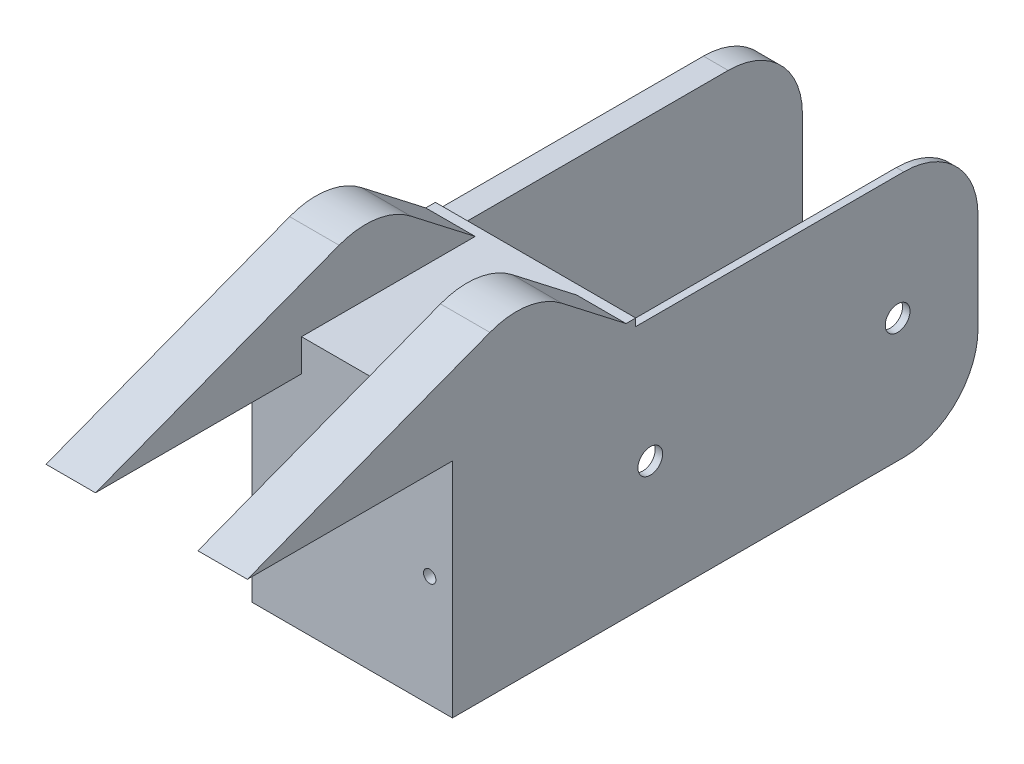
ISO-10303-21;
HEADER;
FILE_DESCRIPTION(('STEP AP214'),'2;1');
FILE_NAME('part.step','',(''),(''),'','','');
FILE_SCHEMA(('AUTOMOTIVE_DESIGN { 1 0 10303 214 1 1 1 1 }'));
ENDSEC;
DATA;
#1=APPLICATION_CONTEXT('core data for automotive mechanical design processes');
#2=APPLICATION_PROTOCOL_DEFINITION('international standard','automotive_design',2000,#1);
#3=PRODUCT_CONTEXT('',#1,'mechanical');
#4=PRODUCT('Part','Part','',(#3));
#5=PRODUCT_RELATED_PRODUCT_CATEGORY('part','',(#4));
#6=PRODUCT_DEFINITION_FORMATION('','',#4);
#7=PRODUCT_DEFINITION_CONTEXT('part definition',#1,'design');
#8=PRODUCT_DEFINITION('design','',#6,#7);
#9=PRODUCT_DEFINITION_SHAPE('','',#8);
#10=(LENGTH_UNIT() NAMED_UNIT(*) SI_UNIT(.MILLI.,.METRE.));
#11=(NAMED_UNIT(*) PLANE_ANGLE_UNIT() SI_UNIT($,.RADIAN.));
#12=(NAMED_UNIT(*) SI_UNIT($,.STERADIAN.) SOLID_ANGLE_UNIT());
#13=UNCERTAINTY_MEASURE_WITH_UNIT(LENGTH_MEASURE(1.E-05),#10,'distance_accuracy_value','');
#14=(GEOMETRIC_REPRESENTATION_CONTEXT(3) GLOBAL_UNCERTAINTY_ASSIGNED_CONTEXT((#13)) GLOBAL_UNIT_ASSIGNED_CONTEXT((#10,
#11,#12)) REPRESENTATION_CONTEXT('',''));
#15=CARTESIAN_POINT('',(0.,0.,0.));
#16=DIRECTION('',(0.,0.,1.));
#17=DIRECTION('',(1.,0.,0.));
#18=AXIS2_PLACEMENT_3D('',#15,#16,#17);
#19=CARTESIAN_POINT('',(0.,50.,0.));
#20=DIRECTION('',(0.,1.,0.));
#21=DIRECTION('',(0.,0.,1.));
#22=AXIS2_PLACEMENT_3D('',#19,#20,#21);
#23=PLANE('',#22);
#24=DIRECTION('',(0.,0.,1.));
#25=VECTOR('',#24,1.);
#26=CARTESIAN_POINT('',(19.5,50.,-212.500000000048));
#27=LINE('',#26,#25);
#28=CARTESIAN_POINT('',(19.5,50.,-182.500000000048));
#29=VERTEX_POINT('',#28);
#30=CARTESIAN_POINT('',(19.5,50.,-74.1157878446346));
#31=VERTEX_POINT('',#30);
#32=EDGE_CURVE('E286',#29,#31,#27,.T.);
#33=ORIENTED_EDGE('',*,*,#32,.F.);
#34=DIRECTION('',(-1.,0.,0.));
#35=VECTOR('',#34,1.);
#36=CARTESIAN_POINT('',(0.,50.,-182.500000000048));
#37=LINE('',#36,#35);
#38=CARTESIAN_POINT('',(9.50000000000002,50.,-182.500000000048));
#39=VERTEX_POINT('',#38);
#40=EDGE_CURVE('E419',#29,#39,#37,.T.);
#41=ORIENTED_EDGE('',*,*,#40,.T.);
#42=DIRECTION('',(0.,0.,1.));
#43=VECTOR('',#42,1.);
#44=CARTESIAN_POINT('',(9.5,50.,0.));
#45=LINE('',#44,#43);
#46=CARTESIAN_POINT('',(9.50000000000001,50.,-74.1157878446346));
#47=VERTEX_POINT('',#46);
#48=EDGE_CURVE('E358',#39,#47,#45,.T.);
#49=ORIENTED_EDGE('',*,*,#48,.T.);
#50=DIRECTION('',(1.,0.,0.));
#51=VECTOR('',#50,1.);
#52=CARTESIAN_POINT('',(9.49999999999999,50.,-74.1157878446346));
#53=LINE('',#52,#51);
#54=EDGE_CURVE('E307',#47,#31,#53,.T.);
#55=ORIENTED_EDGE('',*,*,#54,.T.);
#56=EDGE_LOOP('',(#33,#41,#49,#55));
#57=FACE_BOUND('',#56,.T.);
#58=ADVANCED_FACE('F43',(#57),#23,.T.);
#59=CARTESIAN_POINT('',(0.,-50.,-212.500000000048));
#60=DIRECTION('',(0.,0.,-1.));
#61=DIRECTION('',(-1.,0.,0.));
#62=AXIS2_PLACEMENT_3D('',#59,#60,#61);
#63=PLANE('',#62);
#64=DIRECTION('',(0.,1.,0.));
#65=VECTOR('',#64,1.);
#66=CARTESIAN_POINT('',(9.50000000000002,-50.,-212.500000000048));
#67=LINE('',#66,#65);
#68=CARTESIAN_POINT('',(9.50000000000002,-20.,-212.500000000048));
#69=VERTEX_POINT('',#68);
#70=CARTESIAN_POINT('',(9.50000000000002,20.,-212.500000000048));
#71=VERTEX_POINT('',#70);
#72=EDGE_CURVE('E366',#69,#71,#67,.T.);
#73=ORIENTED_EDGE('',*,*,#72,.T.);
#74=DIRECTION('',(-1.,0.,0.));
#75=VECTOR('',#74,1.);
#76=CARTESIAN_POINT('',(0.,20.,-212.500000000048));
#77=LINE('',#76,#75);
#78=CARTESIAN_POINT('',(19.5,20.,-212.500000000048));
#79=VERTEX_POINT('',#78);
#80=EDGE_CURVE('E59',#71,#79,#77,.F.);
#81=ORIENTED_EDGE('',*,*,#80,.T.);
#82=DIRECTION('',(0.,1.,0.));
#83=VECTOR('',#82,1.);
#84=CARTESIAN_POINT('',(19.5,-50.,-212.500000000048));
#85=LINE('',#84,#83);
#86=CARTESIAN_POINT('',(19.5,-20.,-212.500000000048));
#87=VERTEX_POINT('',#86);
#88=EDGE_CURVE('E283',#87,#79,#85,.T.);
#89=ORIENTED_EDGE('',*,*,#88,.F.);
#90=DIRECTION('',(-1.,0.,0.));
#91=VECTOR('',#90,1.);
#92=CARTESIAN_POINT('',(9.50000000000002,-20.,-212.500000000048));
#93=LINE('',#92,#91);
#94=EDGE_CURVE('E426',#87,#69,#93,.T.);
#95=ORIENTED_EDGE('',*,*,#94,.T.);
#96=EDGE_LOOP('',(#73,#81,#89,#95));
#97=FACE_BOUND('',#96,.T.);
#98=ADVANCED_FACE('F432',(#97),#63,.T.);
#99=CARTESIAN_POINT('',(0.,-50.,0.));
#100=DIRECTION('',(0.,1.,0.));
#101=DIRECTION('',(0.,0.,1.));
#102=AXIS2_PLACEMENT_3D('',#99,#100,#101);
#103=PLANE('',#102);
#104=DIRECTION('',(0.,0.,1.));
#105=VECTOR('',#104,1.);
#106=CARTESIAN_POINT('',(87.5,-50.,0.));
#107=LINE('',#106,#105);
#108=CARTESIAN_POINT('',(87.5,-50.,-182.500000000048));
#109=VERTEX_POINT('',#108);
#110=CARTESIAN_POINT('',(87.5,-50.,-5.));
#111=VERTEX_POINT('',#110);
#112=EDGE_CURVE('E368',#109,#111,#107,.T.);
#113=ORIENTED_EDGE('',*,*,#112,.F.);
#114=DIRECTION('',(-1.,0.,0.));
#115=VECTOR('',#114,1.);
#116=CARTESIAN_POINT('',(90.5,-50.,-182.500000000048));
#117=LINE('',#116,#115);
#118=CARTESIAN_POINT('',(90.5,-50.,-182.500000000048));
#119=VERTEX_POINT('',#118);
#120=EDGE_CURVE('E410',#109,#119,#117,.F.);
#121=ORIENTED_EDGE('',*,*,#120,.T.);
#122=DIRECTION('',(0.,0.,1.));
#123=VECTOR('',#122,1.);
#124=CARTESIAN_POINT('',(90.5,-50.,0.));
#125=LINE('',#124,#123);
#126=CARTESIAN_POINT('',(90.5,-50.,0.));
#127=VERTEX_POINT('',#126);
#128=EDGE_CURVE('E225',#119,#127,#125,.T.);
#129=ORIENTED_EDGE('',*,*,#128,.T.);
#130=DIRECTION('',(1.,0.,0.));
#131=VECTOR('',#130,1.);
#132=CARTESIAN_POINT('',(0.,-50.,0.));
#133=LINE('',#132,#131);
#134=CARTESIAN_POINT('',(9.5,-50.,0.));
#135=VERTEX_POINT('',#134);
#136=EDGE_CURVE('E363',#135,#127,#133,.T.);
#137=ORIENTED_EDGE('',*,*,#136,.F.);
#138=DIRECTION('',(0.,0.,1.));
#139=VECTOR('',#138,1.);
#140=CARTESIAN_POINT('',(9.5,-50.,0.));
#141=LINE('',#140,#139);
#142=CARTESIAN_POINT('',(9.50000000000002,-50.,-182.500000000048));
#143=VERTEX_POINT('',#142);
#144=EDGE_CURVE('E219',#143,#135,#141,.T.);
#145=ORIENTED_EDGE('',*,*,#144,.F.);
#146=DIRECTION('',(-1.,0.,0.));
#147=VECTOR('',#146,1.);
#148=CARTESIAN_POINT('',(19.5,-50.,-182.500000000048));
#149=LINE('',#148,#147);
#150=CARTESIAN_POINT('',(19.5,-50.,-182.500000000048));
#151=VERTEX_POINT('',#150);
#152=EDGE_CURVE('E408',#143,#151,#149,.F.);
#153=ORIENTED_EDGE('',*,*,#152,.T.);
#154=DIRECTION('',(0.,0.,-1.));
#155=VECTOR('',#154,1.);
#156=CARTESIAN_POINT('',(19.5,-50.,-4.99999999999999));
#157=LINE('',#156,#155);
#158=CARTESIAN_POINT('',(19.5,-50.,-5.));
#159=VERTEX_POINT('',#158);
#160=EDGE_CURVE('E281',#159,#151,#157,.T.);
#161=ORIENTED_EDGE('',*,*,#160,.F.);
#162=DIRECTION('',(-1.,0.,0.));
#163=VECTOR('',#162,1.);
#164=CARTESIAN_POINT('',(0.,-50.,-5.));
#165=LINE('',#164,#163);
#166=EDGE_CURVE('E347',#111,#159,#165,.T.);
#167=ORIENTED_EDGE('',*,*,#166,.F.);
#168=EDGE_LOOP('',(#113,#121,#129,#137,#145,#153,#161,#167));
#169=FACE_BOUND('',#168,.T.);
#170=ADVANCED_FACE('F462',(#169),#103,.F.);
#171=CARTESIAN_POINT('',(9.5,-50.,0.));
#172=DIRECTION('',(-1.,0.,0.));
#173=DIRECTION('',(0.,0.,1.));
#174=AXIS2_PLACEMENT_3D('',#171,#172,#173);
#175=PLANE('',#174);
#176=ORIENTED_EDGE('',*,*,#48,.F.);
#177=CARTESIAN_POINT('',(9.50000000000002,20.,-182.500000000048));
#178=DIRECTION('',(-1.,0.,0.));
#179=DIRECTION('',(0.,0.,1.));
#180=AXIS2_PLACEMENT_3D('',#177,#178,#179);
#181=CIRCLE('',#180,30.);
#182=EDGE_CURVE('E424',#39,#71,#181,.T.);
#183=ORIENTED_EDGE('',*,*,#182,.T.);
#184=ORIENTED_EDGE('',*,*,#72,.F.);
#185=CARTESIAN_POINT('',(9.50000000000002,-20.,-182.500000000048));
#186=DIRECTION('',(-1.,0.,0.));
#187=DIRECTION('',(0.,0.,1.));
#188=AXIS2_PLACEMENT_3D('',#185,#186,#187);
#189=CIRCLE('',#188,30.);
#190=EDGE_CURVE('E422',#69,#143,#189,.T.);
#191=ORIENTED_EDGE('',*,*,#190,.T.);
#192=ORIENTED_EDGE('',*,*,#144,.T.);
#193=DIRECTION('',(0.,1.,0.));
#194=VECTOR('',#193,1.);
#195=CARTESIAN_POINT('',(9.5,-50.,0.));
#196=LINE('',#195,#194);
#197=CARTESIAN_POINT('',(9.49999999999999,40.,0.));
#198=VERTEX_POINT('',#197);
#199=EDGE_CURVE('E211',#135,#198,#196,.T.);
#200=ORIENTED_EDGE('',*,*,#199,.T.);
#201=DIRECTION('',(0.,0.,1.));
#202=VECTOR('',#201,1.);
#203=CARTESIAN_POINT('',(9.49999999999999,40.,83.3210101700835));
#204=LINE('',#203,#202);
#205=CARTESIAN_POINT('',(9.49999999999999,40.,83.3210101700835));
#206=VERTEX_POINT('',#205);
#207=EDGE_CURVE('E217',#198,#206,#204,.T.);
#208=ORIENTED_EDGE('',*,*,#207,.T.);
#209=DIRECTION('',(0.,0.355282764480895,-0.934758876535983));
#210=VECTOR('',#209,1.);
#211=CARTESIAN_POINT('',(9.5,83.4152076037248,-30.9056136390671));
#212=LINE('',#211,#210);
#213=CARTESIAN_POINT('',(9.5,77.4412926623105,-15.1880765744224));
#214=VERTEX_POINT('',#213);
#215=EDGE_CURVE('E319',#206,#214,#212,.T.);
#216=ORIENTED_EDGE('',*,*,#215,.T.);
#217=CARTESIAN_POINT('',(9.5,49.3985263662311,-25.8465595088492));
#218=DIRECTION('',(-1.,0.,0.));
#219=DIRECTION('',(0.,0.,1.));
#220=AXIS2_PLACEMENT_3D('',#217,#218,#219);
#221=CIRCLE('',#220,30.);
#222=CARTESIAN_POINT('',(9.5,73.1258995739571,-44.2044395787616));
#223=VERTEX_POINT('',#222);
#224=EDGE_CURVE('E384',#214,#223,#221,.T.);
#225=ORIENTED_EDGE('',*,*,#224,.T.);
#226=DIRECTION('',(0.,-0.611929335663744,-0.790912440257535));
#227=VECTOR('',#226,1.);
#228=CARTESIAN_POINT('',(9.5,83.4152076037248,-30.9056136390671));
#229=LINE('',#228,#227);
#230=CARTESIAN_POINT('',(9.50000000000001,53.,-70.216960006714));
#231=VERTEX_POINT('',#230);
#232=EDGE_CURVE('E236',#223,#231,#229,.T.);
#233=ORIENTED_EDGE('',*,*,#232,.T.);
#234=DIRECTION('',(0.,0.,1.));
#235=VECTOR('',#234,1.);
#236=CARTESIAN_POINT('',(9.49999999999999,53.,-74.1157878446346));
#237=LINE('',#236,#235);
#238=CARTESIAN_POINT('',(9.49999999999999,53.,-74.1157878446346));
#239=VERTEX_POINT('',#238);
#240=EDGE_CURVE('E298',#239,#231,#237,.T.);
#241=ORIENTED_EDGE('',*,*,#240,.F.);
#242=DIRECTION('',(0.,1.,0.));
#243=VECTOR('',#242,1.);
#244=CARTESIAN_POINT('',(9.49999999999999,50.,-74.1157878446346));
#245=LINE('',#244,#243);
#246=EDGE_CURVE('E295',#47,#239,#245,.T.);
#247=ORIENTED_EDGE('',*,*,#246,.F.);
#248=EDGE_LOOP('',(#176,#183,#184,#191,#192,#200,#208,#216,#225,#233,#241,#247));
#249=FACE_BOUND('',#248,.T.);
#250=CARTESIAN_POINT('',(9.5,0.,-80.));
#251=DIRECTION('',(-1.,0.,0.));
#252=DIRECTION('',(0.,0.,1.));
#253=AXIS2_PLACEMENT_3D('',#250,#251,#252);
#254=CIRCLE('',#253,5.);
#255=CARTESIAN_POINT('',(9.5,0.,-75.));
#256=VERTEX_POINT('',#255);
#257=EDGE_CURVE('E341',#256,#256,#254,.T.);
#258=ORIENTED_EDGE('',*,*,#257,.F.);
#259=EDGE_LOOP('',(#258));
#260=FACE_BOUND('',#259,.T.);
#261=CARTESIAN_POINT('',(9.50000000000002,0.,-180.));
#262=DIRECTION('',(-1.,0.,0.));
#263=DIRECTION('',(0.,0.,1.));
#264=AXIS2_PLACEMENT_3D('',#261,#262,#263);
#265=CIRCLE('',#264,4.99999999999999);
#266=CARTESIAN_POINT('',(9.50000000000002,0.,-175.));
#267=VERTEX_POINT('',#266);
#268=EDGE_CURVE('E337',#267,#267,#265,.T.);
#269=ORIENTED_EDGE('',*,*,#268,.F.);
#270=EDGE_LOOP('',(#269));
#271=FACE_BOUND('',#270,.T.);
#272=ADVANCED_FACE('F214',(#249,#260,#271),#175,.T.);
#273=DIRECTION('',(0.,1.,0.));
#274=VECTOR('',#273,1.);
#275=CARTESIAN_POINT('',(90.5,-50.,-212.500000000048));
#276=LINE('',#275,#274);
#277=CARTESIAN_POINT('',(90.5,-20.,-212.500000000048));
#278=VERTEX_POINT('',#277);
#279=CARTESIAN_POINT('',(90.5,20.,-212.500000000048));
#280=VERTEX_POINT('',#279);
#281=EDGE_CURVE('E369',#278,#280,#276,.T.);
#282=ORIENTED_EDGE('',*,*,#281,.F.);
#283=DIRECTION('',(-1.,0.,0.));
#284=VECTOR('',#283,1.);
#285=CARTESIAN_POINT('',(87.5,-20.,-212.500000000048));
#286=LINE('',#285,#284);
#287=CARTESIAN_POINT('',(87.5,-20.,-212.500000000048));
#288=VERTEX_POINT('',#287);
#289=EDGE_CURVE('E401',#278,#288,#286,.T.);
#290=ORIENTED_EDGE('',*,*,#289,.T.);
#291=DIRECTION('',(0.,-1.,0.));
#292=VECTOR('',#291,1.);
#293=CARTESIAN_POINT('',(87.5,50.,-212.500000000048));
#294=LINE('',#293,#292);
#295=CARTESIAN_POINT('',(87.5,20.,-212.500000000048));
#296=VERTEX_POINT('',#295);
#297=EDGE_CURVE('E348',#296,#288,#294,.T.);
#298=ORIENTED_EDGE('',*,*,#297,.F.);
#299=DIRECTION('',(-1.,0.,0.));
#300=VECTOR('',#299,1.);
#301=CARTESIAN_POINT('',(0.,20.,-212.500000000048));
#302=LINE('',#301,#300);
#303=EDGE_CURVE('E399',#296,#280,#302,.F.);
#304=ORIENTED_EDGE('',*,*,#303,.T.);
#305=EDGE_LOOP('',(#282,#290,#298,#304));
#306=FACE_BOUND('',#305,.T.);
#307=ADVANCED_FACE('F475',(#306),#63,.T.);
#308=CARTESIAN_POINT('',(90.5,-50.,0.));
#309=DIRECTION('',(-1.,0.,0.));
#310=DIRECTION('',(0.,0.,1.));
#311=AXIS2_PLACEMENT_3D('',#308,#309,#310);
#312=PLANE('',#311);
#313=CARTESIAN_POINT('',(90.5,0.,-80.));
#314=DIRECTION('',(1.,0.,0.));
#315=DIRECTION('',(0.,0.,-1.));
#316=AXIS2_PLACEMENT_3D('',#313,#314,#315);
#317=CIRCLE('',#316,5.);
#318=CARTESIAN_POINT('',(90.5,0.,-85.));
#319=VERTEX_POINT('',#318);
#320=EDGE_CURVE('E331',#319,#319,#317,.T.);
#321=ORIENTED_EDGE('',*,*,#320,.F.);
#322=EDGE_LOOP('',(#321));
#323=FACE_BOUND('',#322,.T.);
#324=CARTESIAN_POINT('',(90.5,0.,-180.));
#325=DIRECTION('',(1.,0.,0.));
#326=DIRECTION('',(0.,0.,-1.));
#327=AXIS2_PLACEMENT_3D('',#324,#325,#326);
#328=CIRCLE('',#327,4.99999999999999);
#329=CARTESIAN_POINT('',(90.5,0.,-185.));
#330=VERTEX_POINT('',#329);
#331=EDGE_CURVE('E330',#330,#330,#328,.T.);
#332=ORIENTED_EDGE('',*,*,#331,.F.);
#333=EDGE_LOOP('',(#332));
#334=FACE_BOUND('',#333,.T.);
#335=ORIENTED_EDGE('',*,*,#128,.F.);
#336=CARTESIAN_POINT('',(90.5,-20.,-182.500000000048));
#337=DIRECTION('',(-1.,0.,0.));
#338=DIRECTION('',(0.,0.,1.));
#339=AXIS2_PLACEMENT_3D('',#336,#337,#338);
#340=CIRCLE('',#339,30.);
#341=EDGE_CURVE('E414',#119,#278,#340,.F.);
#342=ORIENTED_EDGE('',*,*,#341,.T.);
#343=ORIENTED_EDGE('',*,*,#281,.T.);
#344=CARTESIAN_POINT('',(90.5,20.,-182.500000000048));
#345=DIRECTION('',(-1.,0.,0.));
#346=DIRECTION('',(0.,0.,1.));
#347=AXIS2_PLACEMENT_3D('',#344,#345,#346);
#348=CIRCLE('',#347,30.);
#349=CARTESIAN_POINT('',(90.5,50.,-182.500000000048));
#350=VERTEX_POINT('',#349);
#351=EDGE_CURVE('E412',#280,#350,#348,.F.);
#352=ORIENTED_EDGE('',*,*,#351,.T.);
#353=DIRECTION('',(0.,0.,1.));
#354=VECTOR('',#353,1.);
#355=CARTESIAN_POINT('',(90.5,50.,0.));
#356=LINE('',#355,#354);
#357=CARTESIAN_POINT('',(90.5,50.,-74.1157878446346));
#358=VERTEX_POINT('',#357);
#359=EDGE_CURVE('E360',#350,#358,#356,.T.);
#360=ORIENTED_EDGE('',*,*,#359,.T.);
#361=DIRECTION('',(0.,1.,0.));
#362=VECTOR('',#361,1.);
#363=CARTESIAN_POINT('',(90.5,50.,-74.1157878446346));
#364=LINE('',#363,#362);
#365=CARTESIAN_POINT('',(90.5,53.,-74.1157878446346));
#366=VERTEX_POINT('',#365);
#367=EDGE_CURVE('E294',#358,#366,#364,.T.);
#368=ORIENTED_EDGE('',*,*,#367,.T.);
#369=DIRECTION('',(0.,0.,1.));
#370=VECTOR('',#369,1.);
#371=CARTESIAN_POINT('',(90.5,53.,-74.1157878446346));
#372=LINE('',#371,#370);
#373=CARTESIAN_POINT('',(90.5,53.,-70.216960006714));
#374=VERTEX_POINT('',#373);
#375=EDGE_CURVE('E299',#366,#374,#372,.T.);
#376=ORIENTED_EDGE('',*,*,#375,.T.);
#377=DIRECTION('',(0.,0.611929335663744,0.790912440257535));
#378=VECTOR('',#377,1.);
#379=CARTESIAN_POINT('',(90.5,53.,-70.216960006714));
#380=LINE('',#379,#378);
#381=CARTESIAN_POINT('',(90.5,73.1111584553386,-44.2234923245922));
#382=VERTEX_POINT('',#381);
#383=EDGE_CURVE('E241',#374,#382,#380,.T.);
#384=ORIENTED_EDGE('',*,*,#383,.T.);
#385=CARTESIAN_POINT('',(90.5,49.3837852476125,-25.8656122546799));
#386=DIRECTION('',(-1.,0.,0.));
#387=DIRECTION('',(0.,0.,1.));
#388=AXIS2_PLACEMENT_3D('',#385,#386,#387);
#389=CIRCLE('',#388,30.);
#390=CARTESIAN_POINT('',(90.5,77.4135096930251,-15.1728788569821));
#391=VERTEX_POINT('',#390);
#392=EDGE_CURVE('E393',#382,#391,#389,.F.);
#393=ORIENTED_EDGE('',*,*,#392,.T.);
#394=DIRECTION('',(0.,-0.356424446589924,0.934324148180419));
#395=VECTOR('',#394,1.);
#396=CARTESIAN_POINT('',(90.5,83.4152076037248,-30.9056136390671));
#397=LINE('',#396,#395);
#398=CARTESIAN_POINT('',(90.5,40.,82.9021715746561));
#399=VERTEX_POINT('',#398);
#400=EDGE_CURVE('E245',#391,#399,#397,.T.);
#401=ORIENTED_EDGE('',*,*,#400,.T.);
#402=DIRECTION('',(0.,0.,-1.));
#403=VECTOR('',#402,1.);
#404=CARTESIAN_POINT('',(90.5,40.,82.9021715746561));
#405=LINE('',#404,#403);
#406=CARTESIAN_POINT('',(90.4999999999998,40.,0.));
#407=VERTEX_POINT('',#406);
#408=EDGE_CURVE('E257',#399,#407,#405,.T.);
#409=ORIENTED_EDGE('',*,*,#408,.T.);
#410=DIRECTION('',(0.,1.,0.));
#411=VECTOR('',#410,1.);
#412=CARTESIAN_POINT('',(90.5,-50.,0.));
#413=LINE('',#412,#411);
#414=EDGE_CURVE('E224',#127,#407,#413,.T.);
#415=ORIENTED_EDGE('',*,*,#414,.F.);
#416=EDGE_LOOP('',(#335,#342,#343,#352,#360,#368,#376,#384,#393,#401,#409,#415));
#417=FACE_BOUND('',#416,.T.);
#418=ADVANCED_FACE('F471',(#323,#334,#417),#312,.F.);
#419=CARTESIAN_POINT('',(0.,-50.,0.));
#420=DIRECTION('',(0.,0.,1.));
#421=DIRECTION('',(1.,0.,0.));
#422=AXIS2_PLACEMENT_3D('',#419,#420,#421);
#423=PLANE('',#422);
#424=CARTESIAN_POINT('',(81.3169298827514,-4.99999999989692,0.));
#425=DIRECTION('',(0.,0.,1.));
#426=DIRECTION('',(1.,0.,0.));
#427=AXIS2_PLACEMENT_3D('',#424,#425,#426);
#428=CIRCLE('',#427,2.49999999996991);
#429=CARTESIAN_POINT('',(83.8169298827213,-4.99999999989692,0.));
#430=VERTEX_POINT('',#429);
#431=EDGE_CURVE('E1007',#430,#430,#428,.T.);
#432=ORIENTED_EDGE('',*,*,#431,.F.);
#433=EDGE_LOOP('',(#432));
#434=FACE_BOUND('',#433,.T.);
#435=ORIENTED_EDGE('',*,*,#414,.T.);
#436=DIRECTION('',(1.,0.,0.));
#437=VECTOR('',#436,1.);
#438=CARTESIAN_POINT('',(-50.,40.,0.));
#439=LINE('',#438,#437);
#440=CARTESIAN_POINT('',(70.5,40.,0.));
#441=VERTEX_POINT('',#440);
#442=EDGE_CURVE('E242',#441,#407,#439,.T.);
#443=ORIENTED_EDGE('',*,*,#442,.F.);
#444=DIRECTION('',(0.,1.,0.));
#445=VECTOR('',#444,1.);
#446=CARTESIAN_POINT('',(70.5,40.,0.));
#447=LINE('',#446,#445);
#448=CARTESIAN_POINT('',(70.5,53.,0.));
#449=VERTEX_POINT('',#448);
#450=EDGE_CURVE('E262',#441,#449,#447,.T.);
#451=ORIENTED_EDGE('',*,*,#450,.T.);
#452=DIRECTION('',(1.,0.,0.));
#453=VECTOR('',#452,1.);
#454=CARTESIAN_POINT('',(9.49999999999999,53.,0.));
#455=LINE('',#454,#453);
#456=CARTESIAN_POINT('',(29.5,53.,0.));
#457=VERTEX_POINT('',#456);
#458=EDGE_CURVE('E313',#457,#449,#455,.T.);
#459=ORIENTED_EDGE('',*,*,#458,.F.);
#460=DIRECTION('',(0.,-1.,0.));
#461=VECTOR('',#460,1.);
#462=CARTESIAN_POINT('',(29.5,50.,0.));
#463=LINE('',#462,#461);
#464=CARTESIAN_POINT('',(29.5,40.,0.));
#465=VERTEX_POINT('',#464);
#466=EDGE_CURVE('E240',#457,#465,#463,.T.);
#467=ORIENTED_EDGE('',*,*,#466,.T.);
#468=EDGE_CURVE('E230',#198,#465,#439,.T.);
#469=ORIENTED_EDGE('',*,*,#468,.F.);
#470=ORIENTED_EDGE('',*,*,#199,.F.);
#471=ORIENTED_EDGE('',*,*,#136,.T.);
#472=EDGE_LOOP('',(#435,#443,#451,#459,#467,#469,#470,#471));
#473=FACE_BOUND('',#472,.T.);
#474=ADVANCED_FACE('F238',(#434,#473),#423,.T.);
#475=ORIENTED_EDGE('',*,*,#359,.F.);
#476=DIRECTION('',(-1.,0.,0.));
#477=VECTOR('',#476,1.);
#478=CARTESIAN_POINT('',(0.,50.,-182.500000000048));
#479=LINE('',#478,#477);
#480=CARTESIAN_POINT('',(87.5,50.,-182.500000000048));
#481=VERTEX_POINT('',#480);
#482=EDGE_CURVE('E416',#350,#481,#479,.T.);
#483=ORIENTED_EDGE('',*,*,#482,.T.);
#484=DIRECTION('',(0.,0.,-1.));
#485=VECTOR('',#484,1.);
#486=CARTESIAN_POINT('',(87.5,50.,-5.));
#487=LINE('',#486,#485);
#488=CARTESIAN_POINT('',(87.5,50.,-74.1157878446346));
#489=VERTEX_POINT('',#488);
#490=EDGE_CURVE('E352',#489,#481,#487,.T.);
#491=ORIENTED_EDGE('',*,*,#490,.F.);
#492=EDGE_CURVE('E312',#489,#358,#53,.T.);
#493=ORIENTED_EDGE('',*,*,#492,.T.);
#494=EDGE_LOOP('',(#475,#483,#491,#493));
#495=FACE_BOUND('',#494,.T.);
#496=ADVANCED_FACE('F484',(#495),#23,.T.);
#497=CARTESIAN_POINT('',(87.5,50.,-5.));
#498=DIRECTION('',(-1.,0.,0.));
#499=DIRECTION('',(0.,0.,1.));
#500=AXIS2_PLACEMENT_3D('',#497,#498,#499);
#501=PLANE('',#500);
#502=CARTESIAN_POINT('',(87.5,0.,-80.));
#503=DIRECTION('',(-1.,0.,0.));
#504=DIRECTION('',(0.,0.,1.));
#505=AXIS2_PLACEMENT_3D('',#502,#503,#504);
#506=CIRCLE('',#505,5.);
#507=CARTESIAN_POINT('',(87.5,0.,-75.));
#508=VERTEX_POINT('',#507);
#509=EDGE_CURVE('E340',#508,#508,#506,.T.);
#510=ORIENTED_EDGE('',*,*,#509,.F.);
#511=EDGE_LOOP('',(#510));
#512=FACE_BOUND('',#511,.T.);
#513=CARTESIAN_POINT('',(87.5,0.,-180.));
#514=DIRECTION('',(-1.,0.,0.));
#515=DIRECTION('',(0.,0.,1.));
#516=AXIS2_PLACEMENT_3D('',#513,#514,#515);
#517=CIRCLE('',#516,4.99999999999999);
#518=CARTESIAN_POINT('',(87.5,0.,-175.));
#519=VERTEX_POINT('',#518);
#520=EDGE_CURVE('E334',#519,#519,#517,.T.);
#521=ORIENTED_EDGE('',*,*,#520,.F.);
#522=EDGE_LOOP('',(#521));
#523=FACE_BOUND('',#522,.T.);
#524=ORIENTED_EDGE('',*,*,#297,.T.);
#525=CARTESIAN_POINT('',(87.5,-20.,-182.500000000048));
#526=DIRECTION('',(-1.,0.,0.));
#527=DIRECTION('',(0.,0.,1.));
#528=AXIS2_PLACEMENT_3D('',#525,#526,#527);
#529=CIRCLE('',#528,30.);
#530=EDGE_CURVE('E406',#288,#109,#529,.T.);
#531=ORIENTED_EDGE('',*,*,#530,.T.);
#532=ORIENTED_EDGE('',*,*,#112,.T.);
#533=DIRECTION('',(0.,-1.,0.));
#534=VECTOR('',#533,1.);
#535=CARTESIAN_POINT('',(87.5,50.,-5.));
#536=LINE('',#535,#534);
#537=CARTESIAN_POINT('',(87.5,50.,-5.));
#538=VERTEX_POINT('',#537);
#539=EDGE_CURVE('E344',#538,#111,#536,.T.);
#540=ORIENTED_EDGE('',*,*,#539,.F.);
#541=EDGE_CURVE('E349',#538,#489,#487,.T.);
#542=ORIENTED_EDGE('',*,*,#541,.T.);
#543=ORIENTED_EDGE('',*,*,#490,.T.);
#544=CARTESIAN_POINT('',(87.5,20.,-182.500000000048));
#545=DIRECTION('',(-1.,0.,0.));
#546=DIRECTION('',(0.,0.,1.));
#547=AXIS2_PLACEMENT_3D('',#544,#545,#546);
#548=CIRCLE('',#547,30.);
#549=EDGE_CURVE('E404',#481,#296,#548,.T.);
#550=ORIENTED_EDGE('',*,*,#549,.T.);
#551=EDGE_LOOP('',(#524,#531,#532,#540,#542,#543,#550));
#552=FACE_BOUND('',#551,.T.);
#553=ADVANCED_FACE('F456',(#512,#523,#552),#501,.T.);
#554=CARTESIAN_POINT('',(12.5,50.,-5.));
#555=DIRECTION('',(0.,0.,-1.));
#556=DIRECTION('',(-1.,0.,0.));
#557=AXIS2_PLACEMENT_3D('',#554,#555,#556);
#558=PLANE('',#557);
#559=CARTESIAN_POINT('',(81.3169298827514,-4.99999999989692,-5.));
#560=DIRECTION('',(0.,0.,-1.));
#561=DIRECTION('',(-1.,0.,0.));
#562=AXIS2_PLACEMENT_3D('',#559,#560,#561);
#563=CIRCLE('',#562,2.49999999996991);
#564=CARTESIAN_POINT('',(78.8169298827815,-4.99999999989692,-5.));
#565=VERTEX_POINT('',#564);
#566=EDGE_CURVE('E47',#565,#565,#563,.T.);
#567=ORIENTED_EDGE('',*,*,#566,.F.);
#568=EDGE_LOOP('',(#567));
#569=FACE_BOUND('',#568,.T.);
#570=DIRECTION('',(0.,-1.,0.));
#571=VECTOR('',#570,1.);
#572=CARTESIAN_POINT('',(19.5,50.,-5.));
#573=LINE('',#572,#571);
#574=CARTESIAN_POINT('',(19.5,50.,-5.));
#575=VERTEX_POINT('',#574);
#576=EDGE_CURVE('E276',#575,#159,#573,.T.);
#577=ORIENTED_EDGE('',*,*,#576,.F.);
#578=DIRECTION('',(1.,0.,0.));
#579=VECTOR('',#578,1.);
#580=CARTESIAN_POINT('',(12.5,50.,-5.));
#581=LINE('',#580,#579);
#582=EDGE_CURVE('E345',#575,#538,#581,.T.);
#583=ORIENTED_EDGE('',*,*,#582,.T.);
#584=ORIENTED_EDGE('',*,*,#539,.T.);
#585=ORIENTED_EDGE('',*,*,#166,.T.);
#586=EDGE_LOOP('',(#577,#583,#584,#585));
#587=FACE_BOUND('',#586,.T.);
#588=ADVANCED_FACE('F453',(#569,#587),#558,.T.);
#589=CARTESIAN_POINT('',(-50.,0.,-180.));
#590=DIRECTION('',(1.,0.,0.));
#591=DIRECTION('',(0.,0.,-1.));
#592=AXIS2_PLACEMENT_3D('',#589,#590,#591);
#593=CYLINDRICAL_SURFACE('',#592,4.99999999999999);
#594=ORIENTED_EDGE('',*,*,#520,.T.);
#595=EDGE_LOOP('',(#594));
#596=FACE_BOUND('',#595,.T.);
#597=ORIENTED_EDGE('',*,*,#331,.T.);
#598=EDGE_LOOP('',(#597));
#599=FACE_BOUND('',#598,.T.);
#600=ADVANCED_FACE('F724',(#596,#599),#593,.F.);
#601=CARTESIAN_POINT('',(-50.,0.,-80.));
#602=DIRECTION('',(1.,0.,0.));
#603=DIRECTION('',(0.,0.,-1.));
#604=AXIS2_PLACEMENT_3D('',#601,#602,#603);
#605=CYLINDRICAL_SURFACE('',#604,5.);
#606=ORIENTED_EDGE('',*,*,#509,.T.);
#607=EDGE_LOOP('',(#606));
#608=FACE_BOUND('',#607,.T.);
#609=ORIENTED_EDGE('',*,*,#320,.T.);
#610=EDGE_LOOP('',(#609));
#611=FACE_BOUND('',#610,.T.);
#612=ADVANCED_FACE('F739',(#608,#611),#605,.F.);
#613=ORIENTED_EDGE('',*,*,#268,.T.);
#614=EDGE_LOOP('',(#613));
#615=FACE_BOUND('',#614,.T.);
#616=CARTESIAN_POINT('',(12.5,0.,-180.));
#617=DIRECTION('',(1.,0.,0.));
#618=DIRECTION('',(0.,0.,-1.));
#619=AXIS2_PLACEMENT_3D('',#616,#617,#618);
#620=CIRCLE('',#619,4.99999999999999);
#621=CARTESIAN_POINT('',(12.5,0.,-185.));
#622=VERTEX_POINT('',#621);
#623=EDGE_CURVE('E291',#622,#622,#620,.F.);
#624=ORIENTED_EDGE('',*,*,#623,.F.);
#625=EDGE_LOOP('',(#624));
#626=FACE_BOUND('',#625,.T.);
#627=ADVANCED_FACE('F742',(#615,#626),#593,.F.);
#628=ORIENTED_EDGE('',*,*,#257,.T.);
#629=EDGE_LOOP('',(#628));
#630=FACE_BOUND('',#629,.T.);
#631=CARTESIAN_POINT('',(12.5,0.,-80.));
#632=DIRECTION('',(1.,0.,0.));
#633=DIRECTION('',(0.,0.,-1.));
#634=AXIS2_PLACEMENT_3D('',#631,#632,#633);
#635=CIRCLE('',#634,5.);
#636=CARTESIAN_POINT('',(12.5,0.,-85.));
#637=VERTEX_POINT('',#636);
#638=EDGE_CURVE('E288',#637,#637,#635,.F.);
#639=ORIENTED_EDGE('',*,*,#638,.F.);
#640=EDGE_LOOP('',(#639));
#641=FACE_BOUND('',#640,.T.);
#642=ADVANCED_FACE('F650',(#630,#641),#605,.F.);
#643=CARTESIAN_POINT('',(29.5,40.,83.3210101700835));
#644=DIRECTION('',(0.,-1.,0.));
#645=DIRECTION('',(0.,0.,-1.));
#646=AXIS2_PLACEMENT_3D('',#643,#644,#645);
#647=PLANE('',#646);
#648=CARTESIAN_POINT('',(19.5,40.,8.67307251536487));
#649=DIRECTION('',(0.,-1.,0.));
#650=DIRECTION('',(0.,0.,-1.));
#651=AXIS2_PLACEMENT_3D('',#648,#649,#650);
#652=CIRCLE('',#651,5.);
#653=CARTESIAN_POINT('',(19.5,40.,3.67307251536487));
#654=VERTEX_POINT('',#653);
#655=EDGE_CURVE('E1009',#654,#654,#652,.T.);
#656=ORIENTED_EDGE('',*,*,#655,.F.);
#657=EDGE_LOOP('',(#656));
#658=FACE_BOUND('',#657,.T.);
#659=DIRECTION('',(0.,0.,1.));
#660=VECTOR('',#659,1.);
#661=CARTESIAN_POINT('',(29.5,40.,83.3210101700835));
#662=LINE('',#661,#660);
#663=CARTESIAN_POINT('',(29.5,40.,83.3210101700835));
#664=VERTEX_POINT('',#663);
#665=EDGE_CURVE('E325',#465,#664,#662,.T.);
#666=ORIENTED_EDGE('',*,*,#665,.T.);
#667=DIRECTION('',(-1.,0.,0.));
#668=VECTOR('',#667,1.);
#669=CARTESIAN_POINT('',(29.5,40.,83.3210101700835));
#670=LINE('',#669,#668);
#671=EDGE_CURVE('E233',#664,#206,#670,.T.);
#672=ORIENTED_EDGE('',*,*,#671,.T.);
#673=ORIENTED_EDGE('',*,*,#207,.F.);
#674=ORIENTED_EDGE('',*,*,#468,.T.);
#675=EDGE_LOOP('',(#666,#672,#673,#674));
#676=FACE_BOUND('',#675,.T.);
#677=ADVANCED_FACE('F229',(#658,#676),#647,.T.);
#678=CARTESIAN_POINT('',(29.5,83.4152076037248,-30.9056136390671));
#679=DIRECTION('',(0.,0.934758876535983,0.355282764480895));
#680=DIRECTION('',(0.,-0.355282764480895,0.934758876535983));
#681=AXIS2_PLACEMENT_3D('',#678,#679,#680);
#682=PLANE('',#681);
#683=DIRECTION('',(0.,0.355282764480895,-0.934758876535983));
#684=VECTOR('',#683,1.);
#685=CARTESIAN_POINT('',(29.5,83.4152076037248,-30.9056136390671));
#686=LINE('',#685,#684);
#687=CARTESIAN_POINT('',(29.5,77.4412926623105,-15.1880765744224));
#688=VERTEX_POINT('',#687);
#689=EDGE_CURVE('E235',#664,#688,#686,.T.);
#690=ORIENTED_EDGE('',*,*,#689,.T.);
#691=DIRECTION('',(-1.,0.,0.));
#692=VECTOR('',#691,1.);
#693=CARTESIAN_POINT('',(29.5,77.4412926623105,-15.1880765744224));
#694=LINE('',#693,#692);
#695=EDGE_CURVE('E381',#688,#214,#694,.T.);
#696=ORIENTED_EDGE('',*,*,#695,.T.);
#697=ORIENTED_EDGE('',*,*,#215,.F.);
#698=ORIENTED_EDGE('',*,*,#671,.F.);
#699=EDGE_LOOP('',(#690,#696,#697,#698));
#700=FACE_BOUND('',#699,.T.);
#701=ADVANCED_FACE('F597',(#700),#682,.T.);
#702=CARTESIAN_POINT('',(29.5,50.,-74.0944294831511));
#703=DIRECTION('',(0.,-1.,0.));
#704=DIRECTION('',(0.,0.,-1.));
#705=AXIS2_PLACEMENT_3D('',#702,#703,#704);
#706=PLANE('',#705);
#707=EDGE_CURVE('E285',#31,#575,#27,.T.);
#708=ORIENTED_EDGE('',*,*,#707,.F.);
#709=EDGE_CURVE('E311',#31,#489,#53,.T.);
#710=ORIENTED_EDGE('',*,*,#709,.T.);
#711=ORIENTED_EDGE('',*,*,#541,.F.);
#712=ORIENTED_EDGE('',*,*,#582,.F.);
#713=EDGE_LOOP('',(#708,#710,#711,#712));
#714=FACE_BOUND('',#713,.T.);
#715=ADVANCED_FACE('F448',(#714),#706,.T.);
#716=CARTESIAN_POINT('',(29.5,83.4152076037248,-30.9056136390671));
#717=DIRECTION('',(0.,0.790912440257535,-0.611929335663744));
#718=DIRECTION('',(0.,0.611929335663744,0.790912440257535));
#719=AXIS2_PLACEMENT_3D('',#716,#717,#718);
#720=PLANE('',#719);
#721=ORIENTED_EDGE('',*,*,#232,.F.);
#722=DIRECTION('',(-1.,0.,0.));
#723=VECTOR('',#722,1.);
#724=CARTESIAN_POINT('',(29.5,73.1258995739571,-44.2044395787616));
#725=LINE('',#724,#723);
#726=CARTESIAN_POINT('',(29.5,73.1258995739571,-44.2044395787616));
#727=VERTEX_POINT('',#726);
#728=EDGE_CURVE('E386',#223,#727,#725,.F.);
#729=ORIENTED_EDGE('',*,*,#728,.T.);
#730=DIRECTION('',(0.,-0.611929335663744,-0.790912440257535));
#731=VECTOR('',#730,1.);
#732=CARTESIAN_POINT('',(29.5,83.4152076037248,-30.9056136390671));
#733=LINE('',#732,#731);
#734=CARTESIAN_POINT('',(29.5,53.,-70.216960006714));
#735=VERTEX_POINT('',#734);
#736=EDGE_CURVE('E322',#727,#735,#733,.T.);
#737=ORIENTED_EDGE('',*,*,#736,.T.);
#738=DIRECTION('',(1.,0.,0.));
#739=VECTOR('',#738,1.);
#740=CARTESIAN_POINT('',(29.5,53.,-70.216960006714));
#741=LINE('',#740,#739);
#742=EDGE_CURVE('E310',#231,#735,#741,.T.);
#743=ORIENTED_EDGE('',*,*,#742,.F.);
#744=EDGE_LOOP('',(#721,#729,#737,#743));
#745=FACE_BOUND('',#744,.T.);
#746=ADVANCED_FACE('F616',(#745),#720,.T.);
#747=CARTESIAN_POINT('',(29.5,0.,0.));
#748=DIRECTION('',(1.,0.,0.));
#749=DIRECTION('',(0.,0.,-1.));
#750=AXIS2_PLACEMENT_3D('',#747,#748,#749);
#751=PLANE('',#750);
#752=ORIENTED_EDGE('',*,*,#736,.F.);
#753=CARTESIAN_POINT('',(29.5,49.3985263662311,-25.8465595088492));
#754=DIRECTION('',(1.,0.,0.));
#755=DIRECTION('',(0.,0.,-1.));
#756=AXIS2_PLACEMENT_3D('',#753,#754,#755);
#757=CIRCLE('',#756,30.);
#758=EDGE_CURVE('E388',#727,#688,#757,.T.);
#759=ORIENTED_EDGE('',*,*,#758,.T.);
#760=ORIENTED_EDGE('',*,*,#689,.F.);
#761=ORIENTED_EDGE('',*,*,#665,.F.);
#762=ORIENTED_EDGE('',*,*,#466,.F.);
#763=DIRECTION('',(0.,0.,1.));
#764=VECTOR('',#763,1.);
#765=CARTESIAN_POINT('',(29.5,53.,0.));
#766=LINE('',#765,#764);
#767=EDGE_CURVE('E374',#735,#457,#766,.T.);
#768=ORIENTED_EDGE('',*,*,#767,.F.);
#769=EDGE_LOOP('',(#752,#759,#760,#761,#762,#768));
#770=FACE_BOUND('',#769,.T.);
#771=ADVANCED_FACE('F612',(#770),#751,.T.);
#772=CARTESIAN_POINT('',(9.49999999999999,50.,-74.1157878446346));
#773=DIRECTION('',(0.,0.,-1.));
#774=DIRECTION('',(-1.,0.,0.));
#775=AXIS2_PLACEMENT_3D('',#772,#773,#774);
#776=PLANE('',#775);
#777=ORIENTED_EDGE('',*,*,#367,.F.);
#778=ORIENTED_EDGE('',*,*,#492,.F.);
#779=ORIENTED_EDGE('',*,*,#709,.F.);
#780=ORIENTED_EDGE('',*,*,#54,.F.);
#781=ORIENTED_EDGE('',*,*,#246,.T.);
#782=DIRECTION('',(1.,0.,0.));
#783=VECTOR('',#782,1.);
#784=CARTESIAN_POINT('',(9.49999999999999,53.,-74.1157878446346));
#785=LINE('',#784,#783);
#786=EDGE_CURVE('E302',#239,#366,#785,.T.);
#787=ORIENTED_EDGE('',*,*,#786,.T.);
#788=EDGE_LOOP('',(#777,#778,#779,#780,#781,#787));
#789=FACE_BOUND('',#788,.T.);
#790=ADVANCED_FACE('F487',(#789),#776,.T.);
#791=CARTESIAN_POINT('',(9.49999999999999,53.,-74.1157878446346));
#792=DIRECTION('',(0.,1.,0.));
#793=DIRECTION('',(0.,0.,1.));
#794=AXIS2_PLACEMENT_3D('',#791,#792,#793);
#795=PLANE('',#794);
#796=DIRECTION('',(1.,0.,0.));
#797=VECTOR('',#796,1.);
#798=CARTESIAN_POINT('',(70.5,53.,-70.216960006714));
#799=LINE('',#798,#797);
#800=CARTESIAN_POINT('',(70.5,53.,-70.216960006714));
#801=VERTEX_POINT('',#800);
#802=EDGE_CURVE('E273',#801,#374,#799,.T.);
#803=ORIENTED_EDGE('',*,*,#802,.T.);
#804=ORIENTED_EDGE('',*,*,#375,.F.);
#805=ORIENTED_EDGE('',*,*,#786,.F.);
#806=ORIENTED_EDGE('',*,*,#240,.T.);
#807=ORIENTED_EDGE('',*,*,#742,.T.);
#808=ORIENTED_EDGE('',*,*,#767,.T.);
#809=ORIENTED_EDGE('',*,*,#458,.T.);
#810=DIRECTION('',(0.,0.,-1.));
#811=VECTOR('',#810,1.);
#812=CARTESIAN_POINT('',(70.5,53.,0.));
#813=LINE('',#812,#811);
#814=EDGE_CURVE('E265',#449,#801,#813,.T.);
#815=ORIENTED_EDGE('',*,*,#814,.T.);
#816=EDGE_LOOP('',(#803,#804,#805,#806,#807,#808,#809,#815));
#817=FACE_BOUND('',#816,.T.);
#818=ADVANCED_FACE('F490',(#817),#795,.T.);
#819=CARTESIAN_POINT('',(19.5,0.,0.));
#820=DIRECTION('',(1.,0.,0.));
#821=DIRECTION('',(0.,0.,-1.));
#822=AXIS2_PLACEMENT_3D('',#819,#820,#821);
#823=PLANE('',#822);
#824=ORIENTED_EDGE('',*,*,#88,.T.);
#825=CARTESIAN_POINT('',(19.5,20.,-182.500000000048));
#826=DIRECTION('',(1.,0.,0.));
#827=DIRECTION('',(0.,0.,-1.));
#828=AXIS2_PLACEMENT_3D('',#825,#826,#827);
#829=CIRCLE('',#828,30.);
#830=EDGE_CURVE('E11',#79,#29,#829,.T.);
#831=ORIENTED_EDGE('',*,*,#830,.T.);
#832=ORIENTED_EDGE('',*,*,#32,.T.);
#833=ORIENTED_EDGE('',*,*,#707,.T.);
#834=ORIENTED_EDGE('',*,*,#576,.T.);
#835=ORIENTED_EDGE('',*,*,#160,.T.);
#836=CARTESIAN_POINT('',(19.5,-20.,-182.500000000048));
#837=DIRECTION('',(1.,0.,0.));
#838=DIRECTION('',(0.,0.,-1.));
#839=AXIS2_PLACEMENT_3D('',#836,#837,#838);
#840=CIRCLE('',#839,30.);
#841=EDGE_CURVE('E52',#151,#87,#840,.T.);
#842=ORIENTED_EDGE('',*,*,#841,.T.);
#843=EDGE_LOOP('',(#824,#831,#832,#833,#834,#835,#842));
#844=FACE_BOUND('',#843,.T.);
#845=ADVANCED_FACE('F444',(#844),#823,.T.);
#846=CARTESIAN_POINT('',(12.5,0.,0.));
#847=DIRECTION('',(1.,0.,0.));
#848=DIRECTION('',(0.,0.,-1.));
#849=AXIS2_PLACEMENT_3D('',#846,#847,#848);
#850=PLANE('',#849);
#851=ORIENTED_EDGE('',*,*,#638,.T.);
#852=EDGE_LOOP('',(#851));
#853=FACE_BOUND('',#852,.T.);
#854=ADVANCED_FACE('F783',(#853),#850,.F.);
#855=ORIENTED_EDGE('',*,*,#623,.T.);
#856=EDGE_LOOP('',(#855));
#857=FACE_BOUND('',#856,.T.);
#858=ADVANCED_FACE('F662',(#857),#850,.F.);
#859=CARTESIAN_POINT('',(70.5,40.,82.9021715746561));
#860=DIRECTION('',(0.,-1.,0.));
#861=DIRECTION('',(0.,0.,-1.));
#862=AXIS2_PLACEMENT_3D('',#859,#860,#861);
#863=PLANE('',#862);
#864=CARTESIAN_POINT('',(80.4999999999999,40.,8.67307251536487));
#865=DIRECTION('',(0.,-1.,0.));
#866=DIRECTION('',(0.,0.,-1.));
#867=AXIS2_PLACEMENT_3D('',#864,#865,#866);
#868=CIRCLE('',#867,5.);
#869=CARTESIAN_POINT('',(80.4999999999999,40.,3.67307251536487));
#870=VERTEX_POINT('',#869);
#871=EDGE_CURVE('E1016',#870,#870,#868,.T.);
#872=ORIENTED_EDGE('',*,*,#871,.F.);
#873=EDGE_LOOP('',(#872));
#874=FACE_BOUND('',#873,.T.);
#875=DIRECTION('',(0.,0.,-1.));
#876=VECTOR('',#875,1.);
#877=CARTESIAN_POINT('',(70.5,40.,82.9021715746561));
#878=LINE('',#877,#876);
#879=CARTESIAN_POINT('',(70.5,40.,82.9021715746561));
#880=VERTEX_POINT('',#879);
#881=EDGE_CURVE('E260',#880,#441,#878,.T.);
#882=ORIENTED_EDGE('',*,*,#881,.T.);
#883=ORIENTED_EDGE('',*,*,#442,.T.);
#884=ORIENTED_EDGE('',*,*,#408,.F.);
#885=DIRECTION('',(1.,0.,0.));
#886=VECTOR('',#885,1.);
#887=CARTESIAN_POINT('',(70.5,40.,82.9021715746561));
#888=LINE('',#887,#886);
#889=EDGE_CURVE('E267',#880,#399,#888,.T.);
#890=ORIENTED_EDGE('',*,*,#889,.F.);
#891=EDGE_LOOP('',(#882,#883,#884,#890));
#892=FACE_BOUND('',#891,.T.);
#893=ADVANCED_FACE('F509',(#874,#892),#863,.T.);
#894=CARTESIAN_POINT('',(70.5,53.,-70.216960006714));
#895=DIRECTION('',(0.,0.790912440257535,-0.611929335663744));
#896=DIRECTION('',(0.,0.611929335663744,0.790912440257535));
#897=AXIS2_PLACEMENT_3D('',#894,#895,#896);
#898=PLANE('',#897);
#899=DIRECTION('',(0.,0.611929335663744,0.790912440257535));
#900=VECTOR('',#899,1.);
#901=CARTESIAN_POINT('',(70.5,53.,-70.216960006714));
#902=LINE('',#901,#900);
#903=CARTESIAN_POINT('',(70.5,73.1111584553386,-44.2234923245922));
#904=VERTEX_POINT('',#903);
#905=EDGE_CURVE('E253',#801,#904,#902,.T.);
#906=ORIENTED_EDGE('',*,*,#905,.T.);
#907=DIRECTION('',(1.,0.,0.));
#908=VECTOR('',#907,1.);
#909=CARTESIAN_POINT('',(70.5,73.1111584553386,-44.2234923245922));
#910=LINE('',#909,#908);
#911=EDGE_CURVE('E390',#904,#382,#910,.T.);
#912=ORIENTED_EDGE('',*,*,#911,.T.);
#913=ORIENTED_EDGE('',*,*,#383,.F.);
#914=ORIENTED_EDGE('',*,*,#802,.F.);
#915=EDGE_LOOP('',(#906,#912,#913,#914));
#916=FACE_BOUND('',#915,.T.);
#917=ADVANCED_FACE('F494',(#916),#898,.T.);
#918=CARTESIAN_POINT('',(70.5,83.4152076037248,-30.9056136390671));
#919=DIRECTION('',(0.,0.934324148180419,0.356424446589924));
#920=DIRECTION('',(0.,-0.356424446589924,0.934324148180419));
#921=AXIS2_PLACEMENT_3D('',#918,#919,#920);
#922=PLANE('',#921);
#923=ORIENTED_EDGE('',*,*,#400,.F.);
#924=DIRECTION('',(1.,0.,0.));
#925=VECTOR('',#924,1.);
#926=CARTESIAN_POINT('',(70.5,77.4135096930251,-15.1728788569821));
#927=LINE('',#926,#925);
#928=CARTESIAN_POINT('',(70.5,77.4135096930251,-15.1728788569821));
#929=VERTEX_POINT('',#928);
#930=EDGE_CURVE('E395',#391,#929,#927,.F.);
#931=ORIENTED_EDGE('',*,*,#930,.T.);
#932=DIRECTION('',(0.,-0.356424446589924,0.934324148180419));
#933=VECTOR('',#932,1.);
#934=CARTESIAN_POINT('',(70.5,83.4152076037248,-30.9056136390671));
#935=LINE('',#934,#933);
#936=EDGE_CURVE('E256',#929,#880,#935,.T.);
#937=ORIENTED_EDGE('',*,*,#936,.T.);
#938=ORIENTED_EDGE('',*,*,#889,.T.);
#939=EDGE_LOOP('',(#923,#931,#937,#938));
#940=FACE_BOUND('',#939,.T.);
#941=ADVANCED_FACE('F506',(#940),#922,.T.);
#942=CARTESIAN_POINT('',(70.5,0.,0.));
#943=DIRECTION('',(1.,0.,0.));
#944=DIRECTION('',(0.,0.,-1.));
#945=AXIS2_PLACEMENT_3D('',#942,#943,#944);
#946=PLANE('',#945);
#947=ORIENTED_EDGE('',*,*,#936,.F.);
#948=CARTESIAN_POINT('',(70.5,49.3837852476125,-25.8656122546799));
#949=DIRECTION('',(1.,0.,0.));
#950=DIRECTION('',(0.,0.,-1.));
#951=AXIS2_PLACEMENT_3D('',#948,#949,#950);
#952=CIRCLE('',#951,30.);
#953=EDGE_CURVE('E397',#929,#904,#952,.F.);
#954=ORIENTED_EDGE('',*,*,#953,.T.);
#955=ORIENTED_EDGE('',*,*,#905,.F.);
#956=ORIENTED_EDGE('',*,*,#814,.F.);
#957=ORIENTED_EDGE('',*,*,#450,.F.);
#958=ORIENTED_EDGE('',*,*,#881,.F.);
#959=EDGE_LOOP('',(#947,#954,#955,#956,#957,#958));
#960=FACE_BOUND('',#959,.T.);
#961=ADVANCED_FACE('F498',(#960),#946,.F.);
#962=CARTESIAN_POINT('',(29.5,49.3985263662311,-25.8465595088492));
#963=DIRECTION('',(-1.,0.,0.));
#964=DIRECTION('',(0.,0.,1.));
#965=AXIS2_PLACEMENT_3D('',#962,#963,#964);
#966=CYLINDRICAL_SURFACE('',#965,30.);
#967=ORIENTED_EDGE('',*,*,#758,.F.);
#968=ORIENTED_EDGE('',*,*,#728,.F.);
#969=ORIENTED_EDGE('',*,*,#224,.F.);
#970=ORIENTED_EDGE('',*,*,#695,.F.);
#971=EDGE_LOOP('',(#967,#968,#969,#970));
#972=FACE_BOUND('',#971,.T.);
#973=ADVANCED_FACE('F549',(#972),#966,.T.);
#974=CARTESIAN_POINT('',(70.5,49.3837852476125,-25.8656122546799));
#975=DIRECTION('',(1.,0.,0.));
#976=DIRECTION('',(0.,0.,-1.));
#977=AXIS2_PLACEMENT_3D('',#974,#975,#976);
#978=CYLINDRICAL_SURFACE('',#977,30.);
#979=ORIENTED_EDGE('',*,*,#953,.F.);
#980=ORIENTED_EDGE('',*,*,#930,.F.);
#981=ORIENTED_EDGE('',*,*,#392,.F.);
#982=ORIENTED_EDGE('',*,*,#911,.F.);
#983=EDGE_LOOP('',(#979,#980,#981,#982));
#984=FACE_BOUND('',#983,.T.);
#985=ADVANCED_FACE('F503',(#984),#978,.T.);
#986=CARTESIAN_POINT('',(0.,-20.,-182.500000000048));
#987=DIRECTION('',(1.,0.,0.));
#988=DIRECTION('',(0.,0.,-1.));
#989=AXIS2_PLACEMENT_3D('',#986,#987,#988);
#990=CYLINDRICAL_SURFACE('',#989,30.);
#991=ORIENTED_EDGE('',*,*,#341,.F.);
#992=ORIENTED_EDGE('',*,*,#120,.F.);
#993=ORIENTED_EDGE('',*,*,#530,.F.);
#994=ORIENTED_EDGE('',*,*,#289,.F.);
#995=EDGE_LOOP('',(#991,#992,#993,#994));
#996=FACE_BOUND('',#995,.T.);
#997=ADVANCED_FACE('F467',(#996),#990,.T.);
#998=CARTESIAN_POINT('',(0.,20.,-182.500000000048));
#999=DIRECTION('',(-1.,0.,0.));
#1000=DIRECTION('',(0.,0.,1.));
#1001=AXIS2_PLACEMENT_3D('',#998,#999,#1000);
#1002=CYLINDRICAL_SURFACE('',#1001,30.);
#1003=ORIENTED_EDGE('',*,*,#351,.F.);
#1004=ORIENTED_EDGE('',*,*,#303,.F.);
#1005=ORIENTED_EDGE('',*,*,#549,.F.);
#1006=ORIENTED_EDGE('',*,*,#482,.F.);
#1007=EDGE_LOOP('',(#1003,#1004,#1005,#1006));
#1008=FACE_BOUND('',#1007,.T.);
#1009=ADVANCED_FACE('F479',(#1008),#1002,.T.);
#1010=CARTESIAN_POINT('',(0.,20.,-182.500000000048));
#1011=DIRECTION('',(-1.,0.,0.));
#1012=DIRECTION('',(0.,0.,1.));
#1013=AXIS2_PLACEMENT_3D('',#1010,#1011,#1012);
#1014=CYLINDRICAL_SURFACE('',#1013,30.);
#1015=ORIENTED_EDGE('',*,*,#830,.F.);
#1016=ORIENTED_EDGE('',*,*,#80,.F.);
#1017=ORIENTED_EDGE('',*,*,#182,.F.);
#1018=ORIENTED_EDGE('',*,*,#40,.F.);
#1019=EDGE_LOOP('',(#1015,#1016,#1017,#1018));
#1020=FACE_BOUND('',#1019,.T.);
#1021=ADVANCED_FACE('F438',(#1020),#1014,.T.);
#1022=CARTESIAN_POINT('',(0.,-20.,-182.500000000048));
#1023=DIRECTION('',(1.,0.,0.));
#1024=DIRECTION('',(0.,0.,-1.));
#1025=AXIS2_PLACEMENT_3D('',#1022,#1023,#1024);
#1026=CYLINDRICAL_SURFACE('',#1025,30.);
#1027=ORIENTED_EDGE('',*,*,#841,.F.);
#1028=ORIENTED_EDGE('',*,*,#152,.F.);
#1029=ORIENTED_EDGE('',*,*,#190,.F.);
#1030=ORIENTED_EDGE('',*,*,#94,.F.);
#1031=EDGE_LOOP('',(#1027,#1028,#1029,#1030));
#1032=FACE_BOUND('',#1031,.T.);
#1033=ADVANCED_FACE('F45',(#1032),#1026,.T.);
#1034=CARTESIAN_POINT('',(80.4999999999999,45.,8.67307251536487));
#1035=DIRECTION('',(0.,-1.,0.));
#1036=DIRECTION('',(0.,0.,-1.));
#1037=AXIS2_PLACEMENT_3D('',#1034,#1035,#1036);
#1038=CYLINDRICAL_SURFACE('',#1037,5.);
#1039=CARTESIAN_POINT('',(80.4999999999999,45.,8.67307251536487));
#1040=DIRECTION('',(0.,-1.,0.));
#1041=DIRECTION('',(0.,0.,-1.));
#1042=AXIS2_PLACEMENT_3D('',#1039,#1040,#1041);
#1043=CIRCLE('',#1042,5.);
#1044=CARTESIAN_POINT('',(80.4999999999999,45.,3.67307251536487));
#1045=VERTEX_POINT('',#1044);
#1046=EDGE_CURVE('E248',#1045,#1045,#1043,.T.);
#1047=ORIENTED_EDGE('',*,*,#1046,.F.);
#1048=EDGE_LOOP('',(#1047));
#1049=FACE_BOUND('',#1048,.T.);
#1050=ORIENTED_EDGE('',*,*,#871,.T.);
#1051=EDGE_LOOP('',(#1050));
#1052=FACE_BOUND('',#1051,.T.);
#1053=ADVANCED_FACE('F513',(#1049,#1052),#1038,.F.);
#1054=CARTESIAN_POINT('',(80.4999999999999,45.,8.67307251536487));
#1055=DIRECTION('',(0.,-1.,0.));
#1056=DIRECTION('',(0.,0.,-1.));
#1057=AXIS2_PLACEMENT_3D('',#1054,#1055,#1056);
#1058=PLANE('',#1057);
#1059=ORIENTED_EDGE('',*,*,#1046,.T.);
#1060=EDGE_LOOP('',(#1059));
#1061=FACE_BOUND('',#1060,.T.);
#1062=ADVANCED_FACE('F518',(#1061),#1058,.T.);
#1063=CARTESIAN_POINT('',(19.5,45.,8.67307251536487));
#1064=DIRECTION('',(0.,-1.,0.));
#1065=DIRECTION('',(0.,0.,-1.));
#1066=AXIS2_PLACEMENT_3D('',#1063,#1064,#1065);
#1067=CYLINDRICAL_SURFACE('',#1066,5.);
#1068=CARTESIAN_POINT('',(19.5,45.,8.67307251536487));
#1069=DIRECTION('',(0.,-1.,0.));
#1070=DIRECTION('',(0.,0.,-1.));
#1071=AXIS2_PLACEMENT_3D('',#1068,#1069,#1070);
#1072=CIRCLE('',#1071,5.);
#1073=CARTESIAN_POINT('',(19.5,45.,3.67307251536487));
#1074=VERTEX_POINT('',#1073);
#1075=EDGE_CURVE('E251',#1074,#1074,#1072,.T.);
#1076=ORIENTED_EDGE('',*,*,#1075,.F.);
#1077=EDGE_LOOP('',(#1076));
#1078=FACE_BOUND('',#1077,.T.);
#1079=ORIENTED_EDGE('',*,*,#655,.T.);
#1080=EDGE_LOOP('',(#1079));
#1081=FACE_BOUND('',#1080,.T.);
#1082=ADVANCED_FACE('F683',(#1078,#1081),#1067,.F.);
#1083=CARTESIAN_POINT('',(19.5,45.,8.67307251536487));
#1084=DIRECTION('',(0.,-1.,0.));
#1085=DIRECTION('',(0.,0.,-1.));
#1086=AXIS2_PLACEMENT_3D('',#1083,#1084,#1085);
#1087=PLANE('',#1086);
#1088=ORIENTED_EDGE('',*,*,#1075,.T.);
#1089=EDGE_LOOP('',(#1088));
#1090=FACE_BOUND('',#1089,.T.);
#1091=ADVANCED_FACE('F693',(#1090),#1087,.T.);
#1092=CARTESIAN_POINT('',(81.3169298827514,-4.99999999989692,-50.));
#1093=DIRECTION('',(0.,0.,1.));
#1094=DIRECTION('',(1.,0.,0.));
#1095=AXIS2_PLACEMENT_3D('',#1092,#1093,#1094);
#1096=CYLINDRICAL_SURFACE('',#1095,2.49999999996991);
#1097=ORIENTED_EDGE('',*,*,#566,.T.);
#1098=EDGE_LOOP('',(#1097));
#1099=FACE_BOUND('',#1098,.T.);
#1100=ORIENTED_EDGE('',*,*,#431,.T.);
#1101=EDGE_LOOP('',(#1100));
#1102=FACE_BOUND('',#1101,.T.);
#1103=ADVANCED_FACE('F703',(#1099,#1102),#1096,.F.);
#1104=CLOSED_SHELL('',(#58,#98,#170,#272,#307,#418,#474,#496,#553,#588,#600,#612,#627,#642,#677,
#701,#715,#746,#771,#790,#818,#845,#854,#858,#893,#917,#941,#961,#973,#985,#997,#1009,#1021,
#1033,#1053,#1062,#1082,#1091,#1103));
#1105=MANIFOLD_SOLID_BREP('B2',#1104);
#1106=ADVANCED_BREP_SHAPE_REPRESENTATION('',(#18,#1105),#14);
#1107=SHAPE_DEFINITION_REPRESENTATION(#9,#1106);
ENDSEC;
END-ISO-10303-21;
